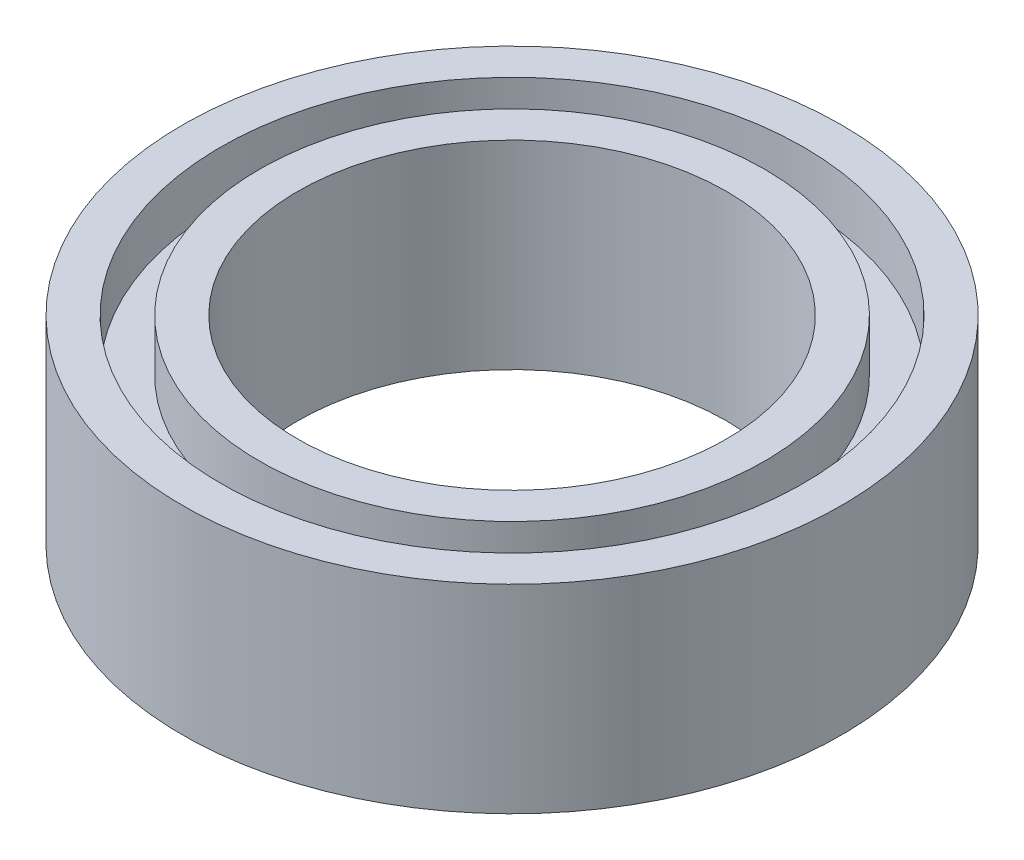
ISO-10303-21;
HEADER;
FILE_DESCRIPTION(('STEP AP214'),'2;1');
FILE_NAME('part.step','',(''),(''),'','','');
FILE_SCHEMA(('AUTOMOTIVE_DESIGN { 1 0 10303 214 1 1 1 1 }'));
ENDSEC;
DATA;
#1=APPLICATION_CONTEXT('core data for automotive mechanical design processes');
#2=APPLICATION_PROTOCOL_DEFINITION('international standard','automotive_design',2000,#1);
#3=PRODUCT_CONTEXT('',#1,'mechanical');
#4=PRODUCT('Part','Part','',(#3));
#5=PRODUCT_RELATED_PRODUCT_CATEGORY('part','',(#4));
#6=PRODUCT_DEFINITION_FORMATION('','',#4);
#7=PRODUCT_DEFINITION_CONTEXT('part definition',#1,'design');
#8=PRODUCT_DEFINITION('design','',#6,#7);
#9=PRODUCT_DEFINITION_SHAPE('','',#8);
#10=(LENGTH_UNIT() NAMED_UNIT(*) SI_UNIT(.MILLI.,.METRE.));
#11=(NAMED_UNIT(*) PLANE_ANGLE_UNIT() SI_UNIT($,.RADIAN.));
#12=(NAMED_UNIT(*) SI_UNIT($,.STERADIAN.) SOLID_ANGLE_UNIT());
#13=UNCERTAINTY_MEASURE_WITH_UNIT(LENGTH_MEASURE(1.E-05),#10,'distance_accuracy_value','');
#14=(GEOMETRIC_REPRESENTATION_CONTEXT(3) GLOBAL_UNCERTAINTY_ASSIGNED_CONTEXT((#13)) GLOBAL_UNIT_ASSIGNED_CONTEXT((#10,
#11,#12)) REPRESENTATION_CONTEXT('',''));
#15=CARTESIAN_POINT('',(0.,0.,0.));
#16=DIRECTION('',(0.,0.,1.));
#17=DIRECTION('',(1.,0.,0.));
#18=AXIS2_PLACEMENT_3D('',#15,#16,#17);
#19=CARTESIAN_POINT('',(0.,-13.159735933671,0.));
#20=DIRECTION('',(0.,-1.,0.));
#21=DIRECTION('',(0.,0.,-1.));
#22=AXIS2_PLACEMENT_3D('',#19,#20,#21);
#23=CYLINDRICAL_SURFACE('',#22,6.3);
#24=CARTESIAN_POINT('',(0.,6.09660828893908,0.));
#25=DIRECTION('',(0.,-1.,0.));
#26=DIRECTION('',(0.,0.,-1.));
#27=AXIS2_PLACEMENT_3D('',#24,#25,#26);
#28=CIRCLE('',#27,6.3);
#29=CARTESIAN_POINT('',(0.,6.09660828893908,-6.3));
#30=VERTEX_POINT('',#29);
#31=EDGE_CURVE('E73',#30,#30,#28,.T.);
#32=ORIENTED_EDGE('',*,*,#31,.F.);
#33=EDGE_LOOP('',(#32));
#34=FACE_BOUND('',#33,.T.);
#35=CARTESIAN_POINT('',(0.,9.89660828893908,0.));
#36=DIRECTION('',(0.,-1.,0.));
#37=DIRECTION('',(0.,0.,-1.));
#38=AXIS2_PLACEMENT_3D('',#35,#36,#37);
#39=CIRCLE('',#38,6.3);
#40=CARTESIAN_POINT('',(0.,9.89660828893908,-6.3));
#41=VERTEX_POINT('',#40);
#42=EDGE_CURVE('E10',#41,#41,#39,.T.);
#43=ORIENTED_EDGE('',*,*,#42,.T.);
#44=EDGE_LOOP('',(#43));
#45=FACE_BOUND('',#44,.T.);
#46=ADVANCED_FACE('F33',(#34,#45),#23,.T.);
#47=CARTESIAN_POINT('',(0.,9.89660828893908,0.));
#48=DIRECTION('',(0.,-1.,0.));
#49=DIRECTION('',(0.,0.,-1.));
#50=AXIS2_PLACEMENT_3D('',#47,#48,#49);
#51=PLANE('',#50);
#52=ORIENTED_EDGE('',*,*,#42,.F.);
#53=EDGE_LOOP('',(#52));
#54=FACE_BOUND('',#53,.T.);
#55=CARTESIAN_POINT('',(0.,9.89660828893908,0.));
#56=DIRECTION('',(0.,-1.,0.));
#57=DIRECTION('',(0.,0.,-1.));
#58=AXIS2_PLACEMENT_3D('',#55,#56,#57);
#59=CIRCLE('',#58,5.56938775510204);
#60=CARTESIAN_POINT('',(0.,9.89660828893908,-5.56938775510204));
#61=VERTEX_POINT('',#60);
#62=EDGE_CURVE('E39',#61,#61,#59,.T.);
#63=ORIENTED_EDGE('',*,*,#62,.T.);
#64=EDGE_LOOP('',(#63));
#65=FACE_BOUND('',#64,.T.);
#66=ADVANCED_FACE('F80',(#54,#65),#51,.F.);
#67=CARTESIAN_POINT('',(0.,-13.159735933671,0.));
#68=DIRECTION('',(0.,-1.,0.));
#69=DIRECTION('',(0.,0.,-1.));
#70=AXIS2_PLACEMENT_3D('',#67,#68,#69);
#71=CYLINDRICAL_SURFACE('',#70,5.56938775510204);
#72=CARTESIAN_POINT('',(0.,8.89660828893908,0.));
#73=DIRECTION('',(0.,-1.,0.));
#74=DIRECTION('',(0.,0.,-1.));
#75=AXIS2_PLACEMENT_3D('',#72,#73,#74);
#76=CIRCLE('',#75,5.56938775510204);
#77=CARTESIAN_POINT('',(0.,8.89660828893908,-5.56938775510204));
#78=VERTEX_POINT('',#77);
#79=EDGE_CURVE('E43',#78,#78,#76,.T.);
#80=ORIENTED_EDGE('',*,*,#79,.T.);
#81=EDGE_LOOP('',(#80));
#82=FACE_BOUND('',#81,.T.);
#83=ORIENTED_EDGE('',*,*,#62,.F.);
#84=EDGE_LOOP('',(#83));
#85=FACE_BOUND('',#84,.T.);
#86=ADVANCED_FACE('F84',(#82,#85),#71,.F.);
#87=CARTESIAN_POINT('',(0.,8.89660828893908,0.));
#88=DIRECTION('',(0.,1.,0.));
#89=DIRECTION('',(0.,0.,1.));
#90=AXIS2_PLACEMENT_3D('',#87,#88,#89);
#91=PLANE('',#90);
#92=CARTESIAN_POINT('',(0.,8.89660828893908,0.));
#93=DIRECTION('',(0.,-1.,0.));
#94=DIRECTION('',(0.,0.,-1.));
#95=AXIS2_PLACEMENT_3D('',#92,#93,#94);
#96=CIRCLE('',#95,4.83061224489796);
#97=CARTESIAN_POINT('',(0.,8.89660828893908,-4.83061224489796));
#98=VERTEX_POINT('',#97);
#99=EDGE_CURVE('E47',#98,#98,#96,.T.);
#100=ORIENTED_EDGE('',*,*,#99,.T.);
#101=EDGE_LOOP('',(#100));
#102=FACE_BOUND('',#101,.T.);
#103=ORIENTED_EDGE('',*,*,#79,.F.);
#104=EDGE_LOOP('',(#103));
#105=FACE_BOUND('',#104,.T.);
#106=ADVANCED_FACE('F89',(#102,#105),#91,.T.);
#107=CARTESIAN_POINT('',(0.,-13.159735933671,0.));
#108=DIRECTION('',(0.,-1.,0.));
#109=DIRECTION('',(0.,0.,-1.));
#110=AXIS2_PLACEMENT_3D('',#107,#108,#109);
#111=CYLINDRICAL_SURFACE('',#110,4.83061224489796);
#112=CARTESIAN_POINT('',(0.,9.89660828893908,0.));
#113=DIRECTION('',(0.,-1.,0.));
#114=DIRECTION('',(0.,0.,-1.));
#115=AXIS2_PLACEMENT_3D('',#112,#113,#114);
#116=CIRCLE('',#115,4.83061224489796);
#117=CARTESIAN_POINT('',(0.,9.89660828893908,-4.83061224489796));
#118=VERTEX_POINT('',#117);
#119=EDGE_CURVE('E52',#118,#118,#116,.T.);
#120=ORIENTED_EDGE('',*,*,#119,.T.);
#121=EDGE_LOOP('',(#120));
#122=FACE_BOUND('',#121,.T.);
#123=ORIENTED_EDGE('',*,*,#99,.F.);
#124=EDGE_LOOP('',(#123));
#125=FACE_BOUND('',#124,.T.);
#126=ADVANCED_FACE('F95',(#122,#125),#111,.T.);
#127=CARTESIAN_POINT('',(0.,9.89660828893908,0.));
#128=DIRECTION('',(0.,-1.,0.));
#129=DIRECTION('',(0.,0.,-1.));
#130=AXIS2_PLACEMENT_3D('',#127,#128,#129);
#131=PLANE('',#130);
#132=ORIENTED_EDGE('',*,*,#119,.F.);
#133=EDGE_LOOP('',(#132));
#134=FACE_BOUND('',#133,.T.);
#135=CARTESIAN_POINT('',(0.,9.89660828893908,0.));
#136=DIRECTION('',(0.,-1.,0.));
#137=DIRECTION('',(0.,0.,-1.));
#138=AXIS2_PLACEMENT_3D('',#135,#136,#137);
#139=CIRCLE('',#138,4.1);
#140=CARTESIAN_POINT('',(0.,9.89660828893908,-4.1));
#141=VERTEX_POINT('',#140);
#142=EDGE_CURVE('E55',#141,#141,#139,.T.);
#143=ORIENTED_EDGE('',*,*,#142,.T.);
#144=EDGE_LOOP('',(#143));
#145=FACE_BOUND('',#144,.T.);
#146=ADVANCED_FACE('F99',(#134,#145),#131,.F.);
#147=CARTESIAN_POINT('',(0.,-13.159735933671,0.));
#148=DIRECTION('',(0.,-1.,0.));
#149=DIRECTION('',(0.,0.,-1.));
#150=AXIS2_PLACEMENT_3D('',#147,#148,#149);
#151=CYLINDRICAL_SURFACE('',#150,4.1);
#152=ORIENTED_EDGE('',*,*,#142,.F.);
#153=EDGE_LOOP('',(#152));
#154=FACE_BOUND('',#153,.T.);
#155=CARTESIAN_POINT('',(0.,6.09660828893908,0.));
#156=DIRECTION('',(0.,-1.,0.));
#157=DIRECTION('',(0.,0.,-1.));
#158=AXIS2_PLACEMENT_3D('',#155,#156,#157);
#159=CIRCLE('',#158,4.1);
#160=CARTESIAN_POINT('',(0.,6.09660828893908,-4.1));
#161=VERTEX_POINT('',#160);
#162=EDGE_CURVE('E58',#161,#161,#159,.T.);
#163=ORIENTED_EDGE('',*,*,#162,.T.);
#164=EDGE_LOOP('',(#163));
#165=FACE_BOUND('',#164,.T.);
#166=ADVANCED_FACE('F103',(#154,#165),#151,.F.);
#167=CARTESIAN_POINT('',(0.,6.09660828893908,0.));
#168=DIRECTION('',(0.,1.,0.));
#169=DIRECTION('',(0.,0.,1.));
#170=AXIS2_PLACEMENT_3D('',#167,#168,#169);
#171=PLANE('',#170);
#172=ORIENTED_EDGE('',*,*,#162,.F.);
#173=EDGE_LOOP('',(#172));
#174=FACE_BOUND('',#173,.T.);
#175=CARTESIAN_POINT('',(0.,6.09660828893908,0.));
#176=DIRECTION('',(0.,-1.,0.));
#177=DIRECTION('',(0.,0.,-1.));
#178=AXIS2_PLACEMENT_3D('',#175,#176,#177);
#179=CIRCLE('',#178,4.83061224489796);
#180=CARTESIAN_POINT('',(0.,6.09660828893908,-4.83061224489796));
#181=VERTEX_POINT('',#180);
#182=EDGE_CURVE('E61',#181,#181,#179,.T.);
#183=ORIENTED_EDGE('',*,*,#182,.T.);
#184=EDGE_LOOP('',(#183));
#185=FACE_BOUND('',#184,.T.);
#186=ADVANCED_FACE('F107',(#174,#185),#171,.F.);
#187=CARTESIAN_POINT('',(0.,-13.159735933671,0.));
#188=DIRECTION('',(0.,-1.,0.));
#189=DIRECTION('',(0.,0.,-1.));
#190=AXIS2_PLACEMENT_3D('',#187,#188,#189);
#191=CYLINDRICAL_SURFACE('',#190,4.83061224489796);
#192=ORIENTED_EDGE('',*,*,#182,.F.);
#193=EDGE_LOOP('',(#192));
#194=FACE_BOUND('',#193,.T.);
#195=CARTESIAN_POINT('',(0.,7.09660828893908,0.));
#196=DIRECTION('',(0.,-1.,0.));
#197=DIRECTION('',(0.,0.,-1.));
#198=AXIS2_PLACEMENT_3D('',#195,#196,#197);
#199=CIRCLE('',#198,4.83061224489796);
#200=CARTESIAN_POINT('',(0.,7.09660828893908,-4.83061224489796));
#201=VERTEX_POINT('',#200);
#202=EDGE_CURVE('E64',#201,#201,#199,.T.);
#203=ORIENTED_EDGE('',*,*,#202,.T.);
#204=EDGE_LOOP('',(#203));
#205=FACE_BOUND('',#204,.T.);
#206=ADVANCED_FACE('F111',(#194,#205),#191,.T.);
#207=CARTESIAN_POINT('',(0.,7.09660828893908,0.));
#208=DIRECTION('',(0.,1.,0.));
#209=DIRECTION('',(0.,0.,1.));
#210=AXIS2_PLACEMENT_3D('',#207,#208,#209);
#211=PLANE('',#210);
#212=ORIENTED_EDGE('',*,*,#202,.F.);
#213=EDGE_LOOP('',(#212));
#214=FACE_BOUND('',#213,.T.);
#215=CARTESIAN_POINT('',(0.,7.09660828893908,0.));
#216=DIRECTION('',(0.,-1.,0.));
#217=DIRECTION('',(0.,0.,-1.));
#218=AXIS2_PLACEMENT_3D('',#215,#216,#217);
#219=CIRCLE('',#218,5.56938775510204);
#220=CARTESIAN_POINT('',(0.,7.09660828893908,-5.56938775510204));
#221=VERTEX_POINT('',#220);
#222=EDGE_CURVE('E67',#221,#221,#219,.T.);
#223=ORIENTED_EDGE('',*,*,#222,.T.);
#224=EDGE_LOOP('',(#223));
#225=FACE_BOUND('',#224,.T.);
#226=ADVANCED_FACE('F115',(#214,#225),#211,.F.);
#227=CARTESIAN_POINT('',(0.,-13.159735933671,0.));
#228=DIRECTION('',(0.,-1.,0.));
#229=DIRECTION('',(0.,0.,-1.));
#230=AXIS2_PLACEMENT_3D('',#227,#228,#229);
#231=CYLINDRICAL_SURFACE('',#230,5.56938775510204);
#232=ORIENTED_EDGE('',*,*,#222,.F.);
#233=EDGE_LOOP('',(#232));
#234=FACE_BOUND('',#233,.T.);
#235=CARTESIAN_POINT('',(0.,6.09660828893908,0.));
#236=DIRECTION('',(0.,-1.,0.));
#237=DIRECTION('',(0.,0.,-1.));
#238=AXIS2_PLACEMENT_3D('',#235,#236,#237);
#239=CIRCLE('',#238,5.56938775510204);
#240=CARTESIAN_POINT('',(0.,6.09660828893908,-5.56938775510204));
#241=VERTEX_POINT('',#240);
#242=EDGE_CURVE('E70',#241,#241,#239,.T.);
#243=ORIENTED_EDGE('',*,*,#242,.T.);
#244=EDGE_LOOP('',(#243));
#245=FACE_BOUND('',#244,.T.);
#246=ADVANCED_FACE('F119',(#234,#245),#231,.F.);
#247=CARTESIAN_POINT('',(0.,6.09660828893908,0.));
#248=DIRECTION('',(0.,1.,0.));
#249=DIRECTION('',(0.,0.,1.));
#250=AXIS2_PLACEMENT_3D('',#247,#248,#249);
#251=PLANE('',#250);
#252=ORIENTED_EDGE('',*,*,#242,.F.);
#253=EDGE_LOOP('',(#252));
#254=FACE_BOUND('',#253,.T.);
#255=ORIENTED_EDGE('',*,*,#31,.T.);
#256=EDGE_LOOP('',(#255));
#257=FACE_BOUND('',#256,.T.);
#258=ADVANCED_FACE('F77',(#254,#257),#251,.F.);
#259=CLOSED_SHELL('',(#46,#66,#86,#106,#126,#146,#166,#186,#206,#226,#246,#258));
#260=MANIFOLD_SOLID_BREP('B2',#259);
#261=ADVANCED_BREP_SHAPE_REPRESENTATION('',(#18,#260),#14);
#262=SHAPE_DEFINITION_REPRESENTATION(#9,#261);
ENDSEC;
END-ISO-10303-21;
